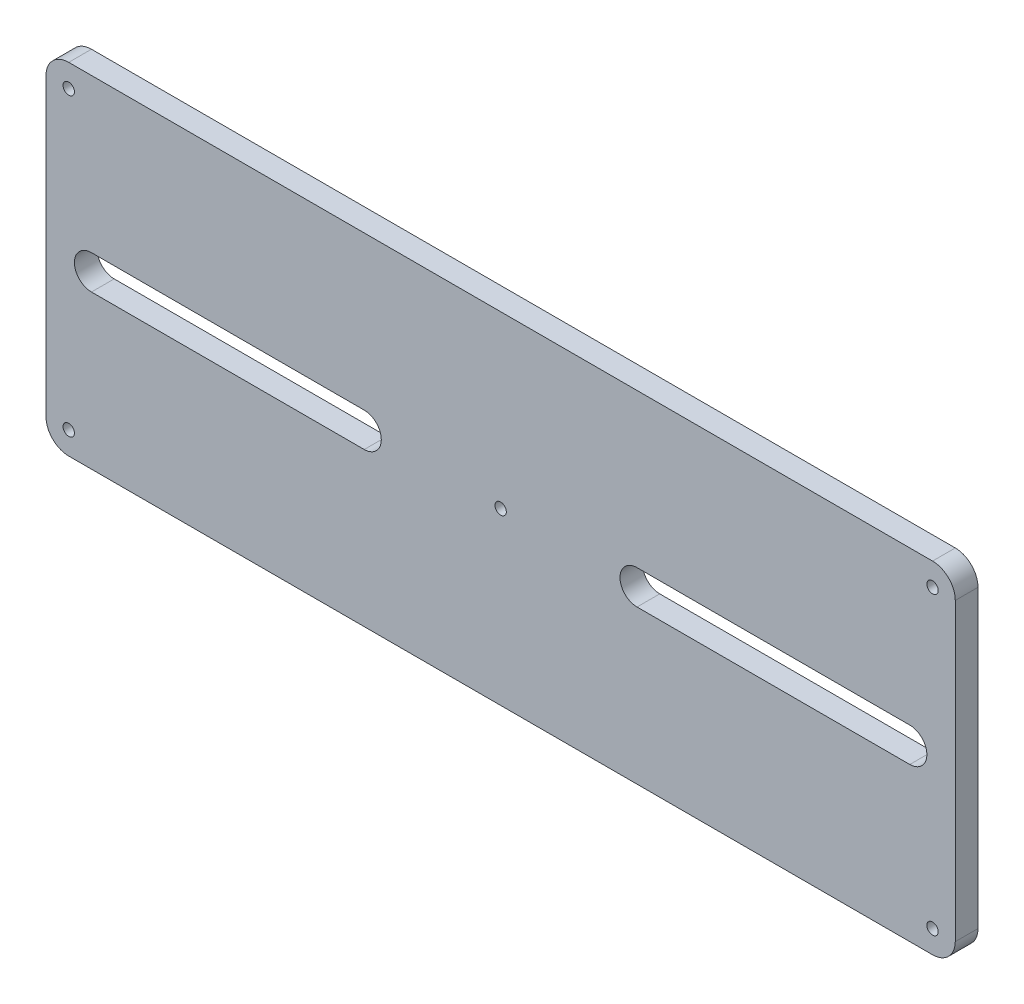
ISO-10303-21;
HEADER;
FILE_DESCRIPTION(('STEP AP214'),'2;1');
FILE_NAME('part.step','',(''),(''),'','','');
FILE_SCHEMA(('AUTOMOTIVE_DESIGN { 1 0 10303 214 1 1 1 1 }'));
ENDSEC;
DATA;
#1=APPLICATION_CONTEXT('core data for automotive mechanical design processes');
#2=APPLICATION_PROTOCOL_DEFINITION('international standard','automotive_design',2000,#1);
#3=PRODUCT_CONTEXT('',#1,'mechanical');
#4=PRODUCT('Part','Part','',(#3));
#5=PRODUCT_RELATED_PRODUCT_CATEGORY('part','',(#4));
#6=PRODUCT_DEFINITION_FORMATION('','',#4);
#7=PRODUCT_DEFINITION_CONTEXT('part definition',#1,'design');
#8=PRODUCT_DEFINITION('design','',#6,#7);
#9=PRODUCT_DEFINITION_SHAPE('','',#8);
#10=(LENGTH_UNIT() NAMED_UNIT(*) SI_UNIT(.MILLI.,.METRE.));
#11=(NAMED_UNIT(*) PLANE_ANGLE_UNIT() SI_UNIT($,.RADIAN.));
#12=(NAMED_UNIT(*) SI_UNIT($,.STERADIAN.) SOLID_ANGLE_UNIT());
#13=UNCERTAINTY_MEASURE_WITH_UNIT(LENGTH_MEASURE(1.E-05),#10,'distance_accuracy_value','');
#14=(GEOMETRIC_REPRESENTATION_CONTEXT(3) GLOBAL_UNCERTAINTY_ASSIGNED_CONTEXT((#13)) GLOBAL_UNIT_ASSIGNED_CONTEXT((#10,
#11,#12)) REPRESENTATION_CONTEXT('',''));
#15=CARTESIAN_POINT('',(0.,0.,0.));
#16=DIRECTION('',(0.,0.,1.));
#17=DIRECTION('',(1.,0.,0.));
#18=AXIS2_PLACEMENT_3D('',#15,#16,#17);
#19=CARTESIAN_POINT('',(-190.,-65.,10.));
#20=DIRECTION('',(0.,0.,-1.));
#21=DIRECTION('',(-1.,0.,0.));
#22=AXIS2_PLACEMENT_3D('',#19,#20,#21);
#23=PLANE('',#22);
#24=DIRECTION('',(-1.,0.,0.));
#25=VECTOR('',#24,1.);
#26=CARTESIAN_POINT('',(-60.,7.5,10.));
#27=LINE('',#26,#25);
#28=CARTESIAN_POINT('',(-60.,7.49999999999999,10.));
#29=VERTEX_POINT('',#28);
#30=CARTESIAN_POINT('',(-180.,7.5,10.));
#31=VERTEX_POINT('',#30);
#32=EDGE_CURVE('E178',#29,#31,#27,.T.);
#33=ORIENTED_EDGE('',*,*,#32,.F.);
#34=CARTESIAN_POINT('',(-60.,0.,10.));
#35=DIRECTION('',(0.,0.,1.));
#36=DIRECTION('',(1.,0.,0.));
#37=AXIS2_PLACEMENT_3D('',#34,#35,#36);
#38=CIRCLE('',#37,7.5);
#39=CARTESIAN_POINT('',(-60.,-7.5,10.));
#40=VERTEX_POINT('',#39);
#41=EDGE_CURVE('E50',#40,#29,#38,.T.);
#42=ORIENTED_EDGE('',*,*,#41,.F.);
#43=DIRECTION('',(1.,0.,0.));
#44=VECTOR('',#43,1.);
#45=CARTESIAN_POINT('',(-60.,-7.5,10.));
#46=LINE('',#45,#44);
#47=CARTESIAN_POINT('',(-180.,-7.5,10.));
#48=VERTEX_POINT('',#47);
#49=EDGE_CURVE('E169',#48,#40,#46,.T.);
#50=ORIENTED_EDGE('',*,*,#49,.F.);
#51=CARTESIAN_POINT('',(-180.,0.,10.));
#52=DIRECTION('',(0.,0.,1.));
#53=DIRECTION('',(1.,0.,0.));
#54=AXIS2_PLACEMENT_3D('',#51,#52,#53);
#55=CIRCLE('',#54,7.5);
#56=EDGE_CURVE('E172',#31,#48,#55,.T.);
#57=ORIENTED_EDGE('',*,*,#56,.F.);
#58=EDGE_LOOP('',(#33,#42,#50,#57));
#59=FACE_BOUND('',#58,.T.);
#60=DIRECTION('',(1.,0.,0.));
#61=VECTOR('',#60,1.);
#62=CARTESIAN_POINT('',(60.,-7.5,10.));
#63=LINE('',#62,#61);
#64=CARTESIAN_POINT('',(60.,-7.5,10.));
#65=VERTEX_POINT('',#64);
#66=CARTESIAN_POINT('',(180.,-7.5,10.));
#67=VERTEX_POINT('',#66);
#68=EDGE_CURVE('E204',#65,#67,#63,.T.);
#69=ORIENTED_EDGE('',*,*,#68,.F.);
#70=CARTESIAN_POINT('',(60.,0.,10.));
#71=DIRECTION('',(0.,0.,1.));
#72=DIRECTION('',(-1.,0.,0.));
#73=AXIS2_PLACEMENT_3D('',#70,#71,#72);
#74=CIRCLE('',#73,7.5);
#75=CARTESIAN_POINT('',(60.,7.5,10.));
#76=VERTEX_POINT('',#75);
#77=EDGE_CURVE('E58',#76,#65,#74,.T.);
#78=ORIENTED_EDGE('',*,*,#77,.F.);
#79=DIRECTION('',(-1.,0.,0.));
#80=VECTOR('',#79,1.);
#81=CARTESIAN_POINT('',(60.,7.5,10.));
#82=LINE('',#81,#80);
#83=CARTESIAN_POINT('',(180.,7.5,10.));
#84=VERTEX_POINT('',#83);
#85=EDGE_CURVE('E193',#84,#76,#82,.T.);
#86=ORIENTED_EDGE('',*,*,#85,.F.);
#87=CARTESIAN_POINT('',(180.,0.,10.));
#88=DIRECTION('',(0.,0.,1.));
#89=DIRECTION('',(-1.,0.,0.));
#90=AXIS2_PLACEMENT_3D('',#87,#88,#89);
#91=CIRCLE('',#90,7.5);
#92=EDGE_CURVE('E208',#67,#84,#91,.T.);
#93=ORIENTED_EDGE('',*,*,#92,.F.);
#94=EDGE_LOOP('',(#69,#78,#86,#93));
#95=FACE_BOUND('',#94,.T.);
#96=CARTESIAN_POINT('',(0.,0.,10.));
#97=DIRECTION('',(0.,0.,1.));
#98=DIRECTION('',(1.,0.,0.));
#99=AXIS2_PLACEMENT_3D('',#96,#97,#98);
#100=CIRCLE('',#99,2.5);
#101=CARTESIAN_POINT('',(2.5,0.,10.));
#102=VERTEX_POINT('',#101);
#103=EDGE_CURVE('E221',#102,#102,#100,.T.);
#104=ORIENTED_EDGE('',*,*,#103,.F.);
#105=EDGE_LOOP('',(#104));
#106=FACE_BOUND('',#105,.T.);
#107=CARTESIAN_POINT('',(-190.,-65.,10.));
#108=DIRECTION('',(0.,0.,1.));
#109=DIRECTION('',(-1.,0.,0.));
#110=AXIS2_PLACEMENT_3D('',#107,#108,#109);
#111=CIRCLE('',#110,10.);
#112=CARTESIAN_POINT('',(-200.,-65.,10.));
#113=VERTEX_POINT('',#112);
#114=CARTESIAN_POINT('',(-190.,-75.,10.));
#115=VERTEX_POINT('',#114);
#116=EDGE_CURVE('E248',#113,#115,#111,.T.);
#117=ORIENTED_EDGE('',*,*,#116,.T.);
#118=DIRECTION('',(1.,0.,0.));
#119=VECTOR('',#118,1.);
#120=CARTESIAN_POINT('',(-190.,-75.,10.));
#121=LINE('',#120,#119);
#122=CARTESIAN_POINT('',(190.,-75.,10.));
#123=VERTEX_POINT('',#122);
#124=EDGE_CURVE('E251',#115,#123,#121,.T.);
#125=ORIENTED_EDGE('',*,*,#124,.T.);
#126=CARTESIAN_POINT('',(190.,-64.9999999999999,10.));
#127=DIRECTION('',(0.,0.,1.));
#128=DIRECTION('',(1.,0.,0.));
#129=AXIS2_PLACEMENT_3D('',#126,#127,#128);
#130=CIRCLE('',#129,10.);
#131=CARTESIAN_POINT('',(200.,-64.9999999999999,10.));
#132=VERTEX_POINT('',#131);
#133=EDGE_CURVE('E254',#123,#132,#130,.T.);
#134=ORIENTED_EDGE('',*,*,#133,.T.);
#135=DIRECTION('',(0.,1.,0.));
#136=VECTOR('',#135,1.);
#137=CARTESIAN_POINT('',(200.,-65.,10.));
#138=LINE('',#137,#136);
#139=CARTESIAN_POINT('',(200.,65.,10.));
#140=VERTEX_POINT('',#139);
#141=EDGE_CURVE('E256',#132,#140,#138,.T.);
#142=ORIENTED_EDGE('',*,*,#141,.T.);
#143=CARTESIAN_POINT('',(190.,64.9999999999999,10.));
#144=DIRECTION('',(0.,0.,1.));
#145=DIRECTION('',(-1.,0.,0.));
#146=AXIS2_PLACEMENT_3D('',#143,#144,#145);
#147=CIRCLE('',#146,10.);
#148=CARTESIAN_POINT('',(190.,75.,10.));
#149=VERTEX_POINT('',#148);
#150=EDGE_CURVE('E258',#140,#149,#147,.T.);
#151=ORIENTED_EDGE('',*,*,#150,.T.);
#152=DIRECTION('',(-1.,0.,0.));
#153=VECTOR('',#152,1.);
#154=CARTESIAN_POINT('',(-190.,75.,10.));
#155=LINE('',#154,#153);
#156=CARTESIAN_POINT('',(-190.,75.,10.));
#157=VERTEX_POINT('',#156);
#158=EDGE_CURVE('E260',#149,#157,#155,.T.);
#159=ORIENTED_EDGE('',*,*,#158,.T.);
#160=CARTESIAN_POINT('',(-190.,64.9999999999999,10.));
#161=DIRECTION('',(0.,0.,1.));
#162=DIRECTION('',(-1.,0.,0.));
#163=AXIS2_PLACEMENT_3D('',#160,#161,#162);
#164=CIRCLE('',#163,10.);
#165=CARTESIAN_POINT('',(-200.,65.,10.));
#166=VERTEX_POINT('',#165);
#167=EDGE_CURVE('E262',#157,#166,#164,.T.);
#168=ORIENTED_EDGE('',*,*,#167,.T.);
#169=DIRECTION('',(0.,-1.,0.));
#170=VECTOR('',#169,1.);
#171=CARTESIAN_POINT('',(-200.,-65.,10.));
#172=LINE('',#171,#170);
#173=EDGE_CURVE('E264',#166,#113,#172,.T.);
#174=ORIENTED_EDGE('',*,*,#173,.T.);
#175=EDGE_LOOP('',(#117,#125,#134,#142,#151,#159,#168,#174));
#176=FACE_BOUND('',#175,.T.);
#177=CARTESIAN_POINT('',(-190.,64.9999999999999,10.));
#178=DIRECTION('',(0.,0.,1.));
#179=DIRECTION('',(1.,0.,0.));
#180=AXIS2_PLACEMENT_3D('',#177,#178,#179);
#181=CIRCLE('',#180,2.5);
#182=CARTESIAN_POINT('',(-187.5,64.9999999999999,10.));
#183=VERTEX_POINT('',#182);
#184=EDGE_CURVE('E242',#183,#183,#181,.T.);
#185=ORIENTED_EDGE('',*,*,#184,.F.);
#186=EDGE_LOOP('',(#185));
#187=FACE_BOUND('',#186,.T.);
#188=CARTESIAN_POINT('',(-190.,-65.,10.));
#189=DIRECTION('',(0.,0.,1.));
#190=DIRECTION('',(-1.,0.,0.));
#191=AXIS2_PLACEMENT_3D('',#188,#189,#190);
#192=CIRCLE('',#191,2.5);
#193=CARTESIAN_POINT('',(-192.5,-65.,10.));
#194=VERTEX_POINT('',#193);
#195=EDGE_CURVE('E236',#194,#194,#192,.T.);
#196=ORIENTED_EDGE('',*,*,#195,.F.);
#197=EDGE_LOOP('',(#196));
#198=FACE_BOUND('',#197,.T.);
#199=CARTESIAN_POINT('',(190.,-64.9999999999999,10.));
#200=DIRECTION('',(0.,0.,1.));
#201=DIRECTION('',(1.,0.,0.));
#202=AXIS2_PLACEMENT_3D('',#199,#200,#201);
#203=CIRCLE('',#202,2.50000000000005);
#204=CARTESIAN_POINT('',(192.5,-64.9999999999999,10.));
#205=VERTEX_POINT('',#204);
#206=EDGE_CURVE('E230',#205,#205,#203,.T.);
#207=ORIENTED_EDGE('',*,*,#206,.F.);
#208=EDGE_LOOP('',(#207));
#209=FACE_BOUND('',#208,.T.);
#210=CARTESIAN_POINT('',(190.,64.9999999999999,10.));
#211=DIRECTION('',(0.,0.,1.));
#212=DIRECTION('',(-1.,0.,0.));
#213=AXIS2_PLACEMENT_3D('',#210,#211,#212);
#214=CIRCLE('',#213,2.50000000000005);
#215=CARTESIAN_POINT('',(187.5,64.9999999999999,10.));
#216=VERTEX_POINT('',#215);
#217=EDGE_CURVE('E224',#216,#216,#214,.T.);
#218=ORIENTED_EDGE('',*,*,#217,.F.);
#219=EDGE_LOOP('',(#218));
#220=FACE_BOUND('',#219,.T.);
#221=ADVANCED_FACE('F35',(#59,#95,#106,#176,#187,#198,#209,#220),#23,.F.);
#222=CARTESIAN_POINT('',(-190.,-65.,0.));
#223=DIRECTION('',(0.,0.,-1.));
#224=DIRECTION('',(-1.,0.,0.));
#225=AXIS2_PLACEMENT_3D('',#222,#223,#224);
#226=PLANE('',#225);
#227=CARTESIAN_POINT('',(-60.,0.,0.));
#228=DIRECTION('',(0.,0.,1.));
#229=DIRECTION('',(1.,0.,0.));
#230=AXIS2_PLACEMENT_3D('',#227,#228,#229);
#231=CIRCLE('',#230,7.5);
#232=CARTESIAN_POINT('',(-60.,-7.5,0.));
#233=VERTEX_POINT('',#232);
#234=CARTESIAN_POINT('',(-60.,7.5,0.));
#235=VERTEX_POINT('',#234);
#236=EDGE_CURVE('E150',#233,#235,#231,.T.);
#237=ORIENTED_EDGE('',*,*,#236,.T.);
#238=DIRECTION('',(-1.,0.,0.));
#239=VECTOR('',#238,1.);
#240=CARTESIAN_POINT('',(-60.,7.5,0.));
#241=LINE('',#240,#239);
#242=CARTESIAN_POINT('',(-180.,7.49999999999999,0.));
#243=VERTEX_POINT('',#242);
#244=EDGE_CURVE('E160',#235,#243,#241,.T.);
#245=ORIENTED_EDGE('',*,*,#244,.T.);
#246=CARTESIAN_POINT('',(-180.,0.,0.));
#247=DIRECTION('',(0.,0.,1.));
#248=DIRECTION('',(1.,0.,0.));
#249=AXIS2_PLACEMENT_3D('',#246,#247,#248);
#250=CIRCLE('',#249,7.5);
#251=CARTESIAN_POINT('',(-180.,-7.5,0.));
#252=VERTEX_POINT('',#251);
#253=EDGE_CURVE('E164',#243,#252,#250,.T.);
#254=ORIENTED_EDGE('',*,*,#253,.T.);
#255=DIRECTION('',(1.,0.,0.));
#256=VECTOR('',#255,1.);
#257=CARTESIAN_POINT('',(-60.,-7.5,0.));
#258=LINE('',#257,#256);
#259=EDGE_CURVE('E156',#252,#233,#258,.T.);
#260=ORIENTED_EDGE('',*,*,#259,.T.);
#261=EDGE_LOOP('',(#237,#245,#254,#260));
#262=FACE_BOUND('',#261,.T.);
#263=CARTESIAN_POINT('',(60.,0.,0.));
#264=DIRECTION('',(0.,0.,1.));
#265=DIRECTION('',(-1.,0.,0.));
#266=AXIS2_PLACEMENT_3D('',#263,#264,#265);
#267=CIRCLE('',#266,7.5);
#268=CARTESIAN_POINT('',(60.,7.5,0.));
#269=VERTEX_POINT('',#268);
#270=CARTESIAN_POINT('',(60.,-7.5,0.));
#271=VERTEX_POINT('',#270);
#272=EDGE_CURVE('E189',#269,#271,#267,.T.);
#273=ORIENTED_EDGE('',*,*,#272,.T.);
#274=DIRECTION('',(1.,0.,0.));
#275=VECTOR('',#274,1.);
#276=CARTESIAN_POINT('',(60.,-7.5,0.));
#277=LINE('',#276,#275);
#278=CARTESIAN_POINT('',(180.,-7.5,0.));
#279=VERTEX_POINT('',#278);
#280=EDGE_CURVE('E192',#271,#279,#277,.T.);
#281=ORIENTED_EDGE('',*,*,#280,.T.);
#282=CARTESIAN_POINT('',(180.,0.,0.));
#283=DIRECTION('',(0.,0.,1.));
#284=DIRECTION('',(-1.,0.,0.));
#285=AXIS2_PLACEMENT_3D('',#282,#283,#284);
#286=CIRCLE('',#285,7.5);
#287=CARTESIAN_POINT('',(180.,7.5,0.));
#288=VERTEX_POINT('',#287);
#289=EDGE_CURVE('E196',#279,#288,#286,.T.);
#290=ORIENTED_EDGE('',*,*,#289,.T.);
#291=DIRECTION('',(-1.,0.,0.));
#292=VECTOR('',#291,1.);
#293=CARTESIAN_POINT('',(60.,7.5,0.));
#294=LINE('',#293,#292);
#295=EDGE_CURVE('E199',#288,#269,#294,.T.);
#296=ORIENTED_EDGE('',*,*,#295,.T.);
#297=EDGE_LOOP('',(#273,#281,#290,#296));
#298=FACE_BOUND('',#297,.T.);
#299=CARTESIAN_POINT('',(0.,0.,0.));
#300=DIRECTION('',(0.,0.,1.));
#301=DIRECTION('',(1.,0.,0.));
#302=AXIS2_PLACEMENT_3D('',#299,#300,#301);
#303=CIRCLE('',#302,2.5);
#304=CARTESIAN_POINT('',(2.5,0.,0.));
#305=VERTEX_POINT('',#304);
#306=EDGE_CURVE('E205',#305,#305,#303,.T.);
#307=ORIENTED_EDGE('',*,*,#306,.T.);
#308=EDGE_LOOP('',(#307));
#309=FACE_BOUND('',#308,.T.);
#310=CARTESIAN_POINT('',(190.,-64.9999999999999,0.));
#311=DIRECTION('',(0.,0.,1.));
#312=DIRECTION('',(1.,0.,0.));
#313=AXIS2_PLACEMENT_3D('',#310,#311,#312);
#314=CIRCLE('',#313,2.50000000000005);
#315=CARTESIAN_POINT('',(192.5,-64.9999999999999,0.));
#316=VERTEX_POINT('',#315);
#317=EDGE_CURVE('E227',#316,#316,#314,.T.);
#318=ORIENTED_EDGE('',*,*,#317,.T.);
#319=EDGE_LOOP('',(#318));
#320=FACE_BOUND('',#319,.T.);
#321=CARTESIAN_POINT('',(-190.,64.9999999999999,0.));
#322=DIRECTION('',(0.,0.,1.));
#323=DIRECTION('',(1.,0.,0.));
#324=AXIS2_PLACEMENT_3D('',#321,#322,#323);
#325=CIRCLE('',#324,2.5);
#326=CARTESIAN_POINT('',(-187.5,64.9999999999999,0.));
#327=VERTEX_POINT('',#326);
#328=EDGE_CURVE('E239',#327,#327,#325,.T.);
#329=ORIENTED_EDGE('',*,*,#328,.T.);
#330=EDGE_LOOP('',(#329));
#331=FACE_BOUND('',#330,.T.);
#332=CARTESIAN_POINT('',(-190.,-65.,0.));
#333=DIRECTION('',(0.,0.,1.));
#334=DIRECTION('',(-1.,0.,0.));
#335=AXIS2_PLACEMENT_3D('',#332,#333,#334);
#336=CIRCLE('',#335,10.);
#337=CARTESIAN_POINT('',(-200.,-65.,0.));
#338=VERTEX_POINT('',#337);
#339=CARTESIAN_POINT('',(-190.,-75.,0.));
#340=VERTEX_POINT('',#339);
#341=EDGE_CURVE('E245',#338,#340,#336,.T.);
#342=ORIENTED_EDGE('',*,*,#341,.F.);
#343=DIRECTION('',(0.,-1.,0.));
#344=VECTOR('',#343,1.);
#345=CARTESIAN_POINT('',(-200.,-65.,0.));
#346=LINE('',#345,#344);
#347=CARTESIAN_POINT('',(-200.,65.,0.));
#348=VERTEX_POINT('',#347);
#349=EDGE_CURVE('E252',#348,#338,#346,.T.);
#350=ORIENTED_EDGE('',*,*,#349,.F.);
#351=CARTESIAN_POINT('',(-190.,64.9999999999999,0.));
#352=DIRECTION('',(0.,0.,1.));
#353=DIRECTION('',(-1.,0.,0.));
#354=AXIS2_PLACEMENT_3D('',#351,#352,#353);
#355=CIRCLE('',#354,10.);
#356=CARTESIAN_POINT('',(-190.,75.,0.));
#357=VERTEX_POINT('',#356);
#358=EDGE_CURVE('E279',#357,#348,#355,.T.);
#359=ORIENTED_EDGE('',*,*,#358,.F.);
#360=DIRECTION('',(-1.,0.,0.));
#361=VECTOR('',#360,1.);
#362=CARTESIAN_POINT('',(-190.,75.,0.));
#363=LINE('',#362,#361);
#364=CARTESIAN_POINT('',(190.,75.,0.));
#365=VERTEX_POINT('',#364);
#366=EDGE_CURVE('E277',#365,#357,#363,.T.);
#367=ORIENTED_EDGE('',*,*,#366,.F.);
#368=CARTESIAN_POINT('',(190.,64.9999999999999,0.));
#369=DIRECTION('',(0.,0.,1.));
#370=DIRECTION('',(-1.,0.,0.));
#371=AXIS2_PLACEMENT_3D('',#368,#369,#370);
#372=CIRCLE('',#371,10.);
#373=CARTESIAN_POINT('',(200.,65.,0.));
#374=VERTEX_POINT('',#373);
#375=EDGE_CURVE('E275',#374,#365,#372,.T.);
#376=ORIENTED_EDGE('',*,*,#375,.F.);
#377=DIRECTION('',(0.,1.,0.));
#378=VECTOR('',#377,1.);
#379=CARTESIAN_POINT('',(200.,-65.,0.));
#380=LINE('',#379,#378);
#381=CARTESIAN_POINT('',(200.,-64.9999999999999,0.));
#382=VERTEX_POINT('',#381);
#383=EDGE_CURVE('E273',#382,#374,#380,.T.);
#384=ORIENTED_EDGE('',*,*,#383,.F.);
#385=CARTESIAN_POINT('',(190.,-64.9999999999999,0.));
#386=DIRECTION('',(0.,0.,1.));
#387=DIRECTION('',(1.,0.,0.));
#388=AXIS2_PLACEMENT_3D('',#385,#386,#387);
#389=CIRCLE('',#388,10.);
#390=CARTESIAN_POINT('',(190.,-75.,0.));
#391=VERTEX_POINT('',#390);
#392=EDGE_CURVE('E271',#391,#382,#389,.T.);
#393=ORIENTED_EDGE('',*,*,#392,.F.);
#394=DIRECTION('',(1.,0.,0.));
#395=VECTOR('',#394,1.);
#396=CARTESIAN_POINT('',(-190.,-75.,0.));
#397=LINE('',#396,#395);
#398=EDGE_CURVE('E269',#340,#391,#397,.T.);
#399=ORIENTED_EDGE('',*,*,#398,.F.);
#400=EDGE_LOOP('',(#342,#350,#359,#367,#376,#384,#393,#399));
#401=FACE_BOUND('',#400,.T.);
#402=CARTESIAN_POINT('',(-190.,-65.,0.));
#403=DIRECTION('',(0.,0.,1.));
#404=DIRECTION('',(-1.,0.,0.));
#405=AXIS2_PLACEMENT_3D('',#402,#403,#404);
#406=CIRCLE('',#405,2.5);
#407=CARTESIAN_POINT('',(-192.5,-65.,0.));
#408=VERTEX_POINT('',#407);
#409=EDGE_CURVE('E233',#408,#408,#406,.T.);
#410=ORIENTED_EDGE('',*,*,#409,.T.);
#411=EDGE_LOOP('',(#410));
#412=FACE_BOUND('',#411,.T.);
#413=CARTESIAN_POINT('',(190.,64.9999999999999,0.));
#414=DIRECTION('',(0.,0.,1.));
#415=DIRECTION('',(-1.,0.,0.));
#416=AXIS2_PLACEMENT_3D('',#413,#414,#415);
#417=CIRCLE('',#416,2.50000000000005);
#418=CARTESIAN_POINT('',(187.5,64.9999999999999,0.));
#419=VERTEX_POINT('',#418);
#420=EDGE_CURVE('E185',#419,#419,#417,.T.);
#421=ORIENTED_EDGE('',*,*,#420,.T.);
#422=EDGE_LOOP('',(#421));
#423=FACE_BOUND('',#422,.T.);
#424=ADVANCED_FACE('F166',(#262,#298,#309,#320,#331,#401,#412,#423),#226,.T.);
#425=CARTESIAN_POINT('',(-190.,-65.,10.));
#426=DIRECTION('',(0.,0.,-1.));
#427=DIRECTION('',(-1.,0.,0.));
#428=AXIS2_PLACEMENT_3D('',#425,#426,#427);
#429=CYLINDRICAL_SURFACE('',#428,10.);
#430=ORIENTED_EDGE('',*,*,#341,.T.);
#431=DIRECTION('',(0.,0.,-1.));
#432=VECTOR('',#431,1.);
#433=CARTESIAN_POINT('',(-190.,-75.,10.));
#434=LINE('',#433,#432);
#435=EDGE_CURVE('E11',#115,#340,#434,.T.);
#436=ORIENTED_EDGE('',*,*,#435,.F.);
#437=ORIENTED_EDGE('',*,*,#116,.F.);
#438=DIRECTION('',(0.,0.,-1.));
#439=VECTOR('',#438,1.);
#440=CARTESIAN_POINT('',(-200.,-65.,10.));
#441=LINE('',#440,#439);
#442=EDGE_CURVE('E266',#113,#338,#441,.T.);
#443=ORIENTED_EDGE('',*,*,#442,.T.);
#444=EDGE_LOOP('',(#430,#436,#437,#443));
#445=FACE_BOUND('',#444,.T.);
#446=ADVANCED_FACE('F37',(#445),#429,.T.);
#447=CARTESIAN_POINT('',(-190.,-75.,10.));
#448=DIRECTION('',(0.,1.,0.));
#449=DIRECTION('',(0.,0.,1.));
#450=AXIS2_PLACEMENT_3D('',#447,#448,#449);
#451=PLANE('',#450);
#452=ORIENTED_EDGE('',*,*,#398,.T.);
#453=DIRECTION('',(0.,0.,-1.));
#454=VECTOR('',#453,1.);
#455=CARTESIAN_POINT('',(190.,-75.,10.));
#456=LINE('',#455,#454);
#457=EDGE_CURVE('E43',#123,#391,#456,.T.);
#458=ORIENTED_EDGE('',*,*,#457,.F.);
#459=ORIENTED_EDGE('',*,*,#124,.F.);
#460=ORIENTED_EDGE('',*,*,#435,.T.);
#461=EDGE_LOOP('',(#452,#458,#459,#460));
#462=FACE_BOUND('',#461,.T.);
#463=ADVANCED_FACE('F326',(#462),#451,.F.);
#464=CARTESIAN_POINT('',(190.,-64.9999999999999,10.));
#465=DIRECTION('',(0.,0.,-1.));
#466=DIRECTION('',(-1.,0.,0.));
#467=AXIS2_PLACEMENT_3D('',#464,#465,#466);
#468=CYLINDRICAL_SURFACE('',#467,10.);
#469=ORIENTED_EDGE('',*,*,#392,.T.);
#470=DIRECTION('',(0.,0.,-1.));
#471=VECTOR('',#470,1.);
#472=CARTESIAN_POINT('',(200.,-64.9999999999999,10.));
#473=LINE('',#472,#471);
#474=EDGE_CURVE('E296',#132,#382,#473,.T.);
#475=ORIENTED_EDGE('',*,*,#474,.F.);
#476=ORIENTED_EDGE('',*,*,#133,.F.);
#477=ORIENTED_EDGE('',*,*,#457,.T.);
#478=EDGE_LOOP('',(#469,#475,#476,#477));
#479=FACE_BOUND('',#478,.T.);
#480=ADVANCED_FACE('F303',(#479),#468,.T.);
#481=CARTESIAN_POINT('',(200.,-65.,10.));
#482=DIRECTION('',(-1.,0.,0.));
#483=DIRECTION('',(0.,-1.,0.));
#484=AXIS2_PLACEMENT_3D('',#481,#482,#483);
#485=PLANE('',#484);
#486=ORIENTED_EDGE('',*,*,#383,.T.);
#487=DIRECTION('',(0.,0.,-1.));
#488=VECTOR('',#487,1.);
#489=CARTESIAN_POINT('',(200.,65.,10.));
#490=LINE('',#489,#488);
#491=EDGE_CURVE('E293',#140,#374,#490,.T.);
#492=ORIENTED_EDGE('',*,*,#491,.F.);
#493=ORIENTED_EDGE('',*,*,#141,.F.);
#494=ORIENTED_EDGE('',*,*,#474,.T.);
#495=EDGE_LOOP('',(#486,#492,#493,#494));
#496=FACE_BOUND('',#495,.T.);
#497=ADVANCED_FACE('F314',(#496),#485,.F.);
#498=CARTESIAN_POINT('',(190.,64.9999999999999,10.));
#499=DIRECTION('',(0.,0.,-1.));
#500=DIRECTION('',(-1.,0.,0.));
#501=AXIS2_PLACEMENT_3D('',#498,#499,#500);
#502=CYLINDRICAL_SURFACE('',#501,10.);
#503=ORIENTED_EDGE('',*,*,#375,.T.);
#504=DIRECTION('',(0.,0.,-1.));
#505=VECTOR('',#504,1.);
#506=CARTESIAN_POINT('',(190.,75.,10.));
#507=LINE('',#506,#505);
#508=EDGE_CURVE('E290',#149,#365,#507,.T.);
#509=ORIENTED_EDGE('',*,*,#508,.F.);
#510=ORIENTED_EDGE('',*,*,#150,.F.);
#511=ORIENTED_EDGE('',*,*,#491,.T.);
#512=EDGE_LOOP('',(#503,#509,#510,#511));
#513=FACE_BOUND('',#512,.T.);
#514=ADVANCED_FACE('F318',(#513),#502,.T.);
#515=CARTESIAN_POINT('',(-190.,75.,10.));
#516=DIRECTION('',(0.,-1.,0.));
#517=DIRECTION('',(0.,0.,-1.));
#518=AXIS2_PLACEMENT_3D('',#515,#516,#517);
#519=PLANE('',#518);
#520=ORIENTED_EDGE('',*,*,#366,.T.);
#521=DIRECTION('',(0.,0.,-1.));
#522=VECTOR('',#521,1.);
#523=CARTESIAN_POINT('',(-190.,75.,10.));
#524=LINE('',#523,#522);
#525=EDGE_CURVE('E287',#157,#357,#524,.T.);
#526=ORIENTED_EDGE('',*,*,#525,.F.);
#527=ORIENTED_EDGE('',*,*,#158,.F.);
#528=ORIENTED_EDGE('',*,*,#508,.T.);
#529=EDGE_LOOP('',(#520,#526,#527,#528));
#530=FACE_BOUND('',#529,.T.);
#531=ADVANCED_FACE('F339',(#530),#519,.F.);
#532=CARTESIAN_POINT('',(-190.,64.9999999999999,10.));
#533=DIRECTION('',(0.,0.,-1.));
#534=DIRECTION('',(-1.,0.,0.));
#535=AXIS2_PLACEMENT_3D('',#532,#533,#534);
#536=CYLINDRICAL_SURFACE('',#535,10.);
#537=ORIENTED_EDGE('',*,*,#358,.T.);
#538=DIRECTION('',(0.,0.,-1.));
#539=VECTOR('',#538,1.);
#540=CARTESIAN_POINT('',(-200.,65.,10.));
#541=LINE('',#540,#539);
#542=EDGE_CURVE('E284',#166,#348,#541,.T.);
#543=ORIENTED_EDGE('',*,*,#542,.F.);
#544=ORIENTED_EDGE('',*,*,#167,.F.);
#545=ORIENTED_EDGE('',*,*,#525,.T.);
#546=EDGE_LOOP('',(#537,#543,#544,#545));
#547=FACE_BOUND('',#546,.T.);
#548=ADVANCED_FACE('F337',(#547),#536,.T.);
#549=CARTESIAN_POINT('',(-200.,-65.,10.));
#550=DIRECTION('',(1.,0.,0.));
#551=DIRECTION('',(0.,1.,0.));
#552=AXIS2_PLACEMENT_3D('',#549,#550,#551);
#553=PLANE('',#552);
#554=ORIENTED_EDGE('',*,*,#349,.T.);
#555=ORIENTED_EDGE('',*,*,#442,.F.);
#556=ORIENTED_EDGE('',*,*,#173,.F.);
#557=ORIENTED_EDGE('',*,*,#542,.T.);
#558=EDGE_LOOP('',(#554,#555,#556,#557));
#559=FACE_BOUND('',#558,.T.);
#560=ADVANCED_FACE('F332',(#559),#553,.F.);
#561=CARTESIAN_POINT('',(-190.,64.9999999999999,10.));
#562=DIRECTION('',(0.,0.,-1.));
#563=DIRECTION('',(-1.,0.,0.));
#564=AXIS2_PLACEMENT_3D('',#561,#562,#563);
#565=CYLINDRICAL_SURFACE('',#564,2.5);
#566=ORIENTED_EDGE('',*,*,#184,.T.);
#567=EDGE_LOOP('',(#566));
#568=FACE_BOUND('',#567,.T.);
#569=ORIENTED_EDGE('',*,*,#328,.F.);
#570=EDGE_LOOP('',(#569));
#571=FACE_BOUND('',#570,.T.);
#572=ADVANCED_FACE('F357',(#568,#571),#565,.F.);
#573=CARTESIAN_POINT('',(-190.,-65.,10.));
#574=DIRECTION('',(0.,0.,-1.));
#575=DIRECTION('',(-1.,0.,0.));
#576=AXIS2_PLACEMENT_3D('',#573,#574,#575);
#577=CYLINDRICAL_SURFACE('',#576,2.5);
#578=ORIENTED_EDGE('',*,*,#195,.T.);
#579=EDGE_LOOP('',(#578));
#580=FACE_BOUND('',#579,.T.);
#581=ORIENTED_EDGE('',*,*,#409,.F.);
#582=EDGE_LOOP('',(#581));
#583=FACE_BOUND('',#582,.T.);
#584=ADVANCED_FACE('F364',(#580,#583),#577,.F.);
#585=CARTESIAN_POINT('',(190.,-64.9999999999999,10.));
#586=DIRECTION('',(0.,0.,-1.));
#587=DIRECTION('',(-1.,0.,0.));
#588=AXIS2_PLACEMENT_3D('',#585,#586,#587);
#589=CYLINDRICAL_SURFACE('',#588,2.50000000000005);
#590=ORIENTED_EDGE('',*,*,#206,.T.);
#591=EDGE_LOOP('',(#590));
#592=FACE_BOUND('',#591,.T.);
#593=ORIENTED_EDGE('',*,*,#317,.F.);
#594=EDGE_LOOP('',(#593));
#595=FACE_BOUND('',#594,.T.);
#596=ADVANCED_FACE('F369',(#592,#595),#589,.F.);
#597=CARTESIAN_POINT('',(190.,64.9999999999999,10.));
#598=DIRECTION('',(0.,0.,-1.));
#599=DIRECTION('',(-1.,0.,0.));
#600=AXIS2_PLACEMENT_3D('',#597,#598,#599);
#601=CYLINDRICAL_SURFACE('',#600,2.50000000000005);
#602=ORIENTED_EDGE('',*,*,#217,.T.);
#603=EDGE_LOOP('',(#602));
#604=FACE_BOUND('',#603,.T.);
#605=ORIENTED_EDGE('',*,*,#420,.F.);
#606=EDGE_LOOP('',(#605));
#607=FACE_BOUND('',#606,.T.);
#608=ADVANCED_FACE('F382',(#604,#607),#601,.F.);
#609=CARTESIAN_POINT('',(0.,0.,0.));
#610=DIRECTION('',(0.,0.,1.));
#611=DIRECTION('',(1.,0.,0.));
#612=AXIS2_PLACEMENT_3D('',#609,#610,#611);
#613=CYLINDRICAL_SURFACE('',#612,2.5);
#614=ORIENTED_EDGE('',*,*,#306,.F.);
#615=EDGE_LOOP('',(#614));
#616=FACE_BOUND('',#615,.T.);
#617=ORIENTED_EDGE('',*,*,#103,.T.);
#618=EDGE_LOOP('',(#617));
#619=FACE_BOUND('',#618,.T.);
#620=ADVANCED_FACE('F385',(#616,#619),#613,.F.);
#621=CARTESIAN_POINT('',(60.,0.,0.));
#622=DIRECTION('',(0.,0.,1.));
#623=DIRECTION('',(1.,0.,0.));
#624=AXIS2_PLACEMENT_3D('',#621,#622,#623);
#625=CYLINDRICAL_SURFACE('',#624,7.5);
#626=ORIENTED_EDGE('',*,*,#77,.T.);
#627=DIRECTION('',(0.,0.,1.));
#628=VECTOR('',#627,1.);
#629=CARTESIAN_POINT('',(60.,-7.5,0.));
#630=LINE('',#629,#628);
#631=EDGE_CURVE('E202',#271,#65,#630,.T.);
#632=ORIENTED_EDGE('',*,*,#631,.F.);
#633=ORIENTED_EDGE('',*,*,#272,.F.);
#634=DIRECTION('',(0.,0.,1.));
#635=VECTOR('',#634,1.);
#636=CARTESIAN_POINT('',(60.,7.5,0.));
#637=LINE('',#636,#635);
#638=EDGE_CURVE('E179',#269,#76,#637,.T.);
#639=ORIENTED_EDGE('',*,*,#638,.T.);
#640=EDGE_LOOP('',(#626,#632,#633,#639));
#641=FACE_BOUND('',#640,.T.);
#642=ADVANCED_FACE('F393',(#641),#625,.F.);
#643=CARTESIAN_POINT('',(60.,7.5,0.));
#644=DIRECTION('',(0.,1.,0.));
#645=DIRECTION('',(0.,0.,1.));
#646=AXIS2_PLACEMENT_3D('',#643,#644,#645);
#647=PLANE('',#646);
#648=ORIENTED_EDGE('',*,*,#85,.T.);
#649=ORIENTED_EDGE('',*,*,#638,.F.);
#650=ORIENTED_EDGE('',*,*,#295,.F.);
#651=DIRECTION('',(0.,0.,1.));
#652=VECTOR('',#651,1.);
#653=CARTESIAN_POINT('',(180.,7.5,0.));
#654=LINE('',#653,#652);
#655=EDGE_CURVE('E214',#288,#84,#654,.T.);
#656=ORIENTED_EDGE('',*,*,#655,.T.);
#657=EDGE_LOOP('',(#648,#649,#650,#656));
#658=FACE_BOUND('',#657,.T.);
#659=ADVANCED_FACE('F401',(#658),#647,.F.);
#660=CARTESIAN_POINT('',(180.,0.,0.));
#661=DIRECTION('',(0.,0.,1.));
#662=DIRECTION('',(1.,0.,0.));
#663=AXIS2_PLACEMENT_3D('',#660,#661,#662);
#664=CYLINDRICAL_SURFACE('',#663,7.5);
#665=ORIENTED_EDGE('',*,*,#92,.T.);
#666=ORIENTED_EDGE('',*,*,#655,.F.);
#667=ORIENTED_EDGE('',*,*,#289,.F.);
#668=DIRECTION('',(0.,0.,1.));
#669=VECTOR('',#668,1.);
#670=CARTESIAN_POINT('',(180.,-7.5,0.));
#671=LINE('',#670,#669);
#672=EDGE_CURVE('E216',#279,#67,#671,.T.);
#673=ORIENTED_EDGE('',*,*,#672,.T.);
#674=EDGE_LOOP('',(#665,#666,#667,#673));
#675=FACE_BOUND('',#674,.T.);
#676=ADVANCED_FACE('F405',(#675),#664,.F.);
#677=CARTESIAN_POINT('',(60.,-7.5,0.));
#678=DIRECTION('',(0.,-1.,0.));
#679=DIRECTION('',(0.,0.,-1.));
#680=AXIS2_PLACEMENT_3D('',#677,#678,#679);
#681=PLANE('',#680);
#682=ORIENTED_EDGE('',*,*,#68,.T.);
#683=ORIENTED_EDGE('',*,*,#672,.F.);
#684=ORIENTED_EDGE('',*,*,#280,.F.);
#685=ORIENTED_EDGE('',*,*,#631,.T.);
#686=EDGE_LOOP('',(#682,#683,#684,#685));
#687=FACE_BOUND('',#686,.T.);
#688=ADVANCED_FACE('F402',(#687),#681,.F.);
#689=CARTESIAN_POINT('',(-60.,0.,0.));
#690=DIRECTION('',(0.,0.,1.));
#691=DIRECTION('',(1.,0.,0.));
#692=AXIS2_PLACEMENT_3D('',#689,#690,#691);
#693=CYLINDRICAL_SURFACE('',#692,7.5);
#694=ORIENTED_EDGE('',*,*,#41,.T.);
#695=DIRECTION('',(0.,0.,1.));
#696=VECTOR('',#695,1.);
#697=CARTESIAN_POINT('',(-60.,7.5,0.));
#698=LINE('',#697,#696);
#699=EDGE_CURVE('E146',#235,#29,#698,.T.);
#700=ORIENTED_EDGE('',*,*,#699,.F.);
#701=ORIENTED_EDGE('',*,*,#236,.F.);
#702=DIRECTION('',(0.,0.,1.));
#703=VECTOR('',#702,1.);
#704=CARTESIAN_POINT('',(-60.,-7.5,0.));
#705=LINE('',#704,#703);
#706=EDGE_CURVE('E183',#233,#40,#705,.T.);
#707=ORIENTED_EDGE('',*,*,#706,.T.);
#708=EDGE_LOOP('',(#694,#700,#701,#707));
#709=FACE_BOUND('',#708,.T.);
#710=ADVANCED_FACE('F148',(#709),#693,.F.);
#711=CARTESIAN_POINT('',(-60.,-7.5,0.));
#712=DIRECTION('',(0.,-1.,0.));
#713=DIRECTION('',(0.,0.,-1.));
#714=AXIS2_PLACEMENT_3D('',#711,#712,#713);
#715=PLANE('',#714);
#716=ORIENTED_EDGE('',*,*,#49,.T.);
#717=ORIENTED_EDGE('',*,*,#706,.F.);
#718=ORIENTED_EDGE('',*,*,#259,.F.);
#719=DIRECTION('',(0.,0.,1.));
#720=VECTOR('',#719,1.);
#721=CARTESIAN_POINT('',(-180.,-7.5,0.));
#722=LINE('',#721,#720);
#723=EDGE_CURVE('E186',#252,#48,#722,.T.);
#724=ORIENTED_EDGE('',*,*,#723,.T.);
#725=EDGE_LOOP('',(#716,#717,#718,#724));
#726=FACE_BOUND('',#725,.T.);
#727=ADVANCED_FACE('F415',(#726),#715,.F.);
#728=CARTESIAN_POINT('',(-180.,0.,0.));
#729=DIRECTION('',(0.,0.,1.));
#730=DIRECTION('',(1.,0.,0.));
#731=AXIS2_PLACEMENT_3D('',#728,#729,#730);
#732=CYLINDRICAL_SURFACE('',#731,7.5);
#733=ORIENTED_EDGE('',*,*,#56,.T.);
#734=ORIENTED_EDGE('',*,*,#723,.F.);
#735=ORIENTED_EDGE('',*,*,#253,.F.);
#736=DIRECTION('',(0.,0.,1.));
#737=VECTOR('',#736,1.);
#738=CARTESIAN_POINT('',(-180.,7.5,0.));
#739=LINE('',#738,#737);
#740=EDGE_CURVE('E155',#243,#31,#739,.T.);
#741=ORIENTED_EDGE('',*,*,#740,.T.);
#742=EDGE_LOOP('',(#733,#734,#735,#741));
#743=FACE_BOUND('',#742,.T.);
#744=ADVANCED_FACE('F418',(#743),#732,.F.);
#745=CARTESIAN_POINT('',(-60.,7.5,0.));
#746=DIRECTION('',(0.,1.,0.));
#747=DIRECTION('',(0.,0.,1.));
#748=AXIS2_PLACEMENT_3D('',#745,#746,#747);
#749=PLANE('',#748);
#750=ORIENTED_EDGE('',*,*,#32,.T.);
#751=ORIENTED_EDGE('',*,*,#740,.F.);
#752=ORIENTED_EDGE('',*,*,#244,.F.);
#753=ORIENTED_EDGE('',*,*,#699,.T.);
#754=EDGE_LOOP('',(#750,#751,#752,#753));
#755=FACE_BOUND('',#754,.T.);
#756=ADVANCED_FACE('F161',(#755),#749,.F.);
#757=CLOSED_SHELL('',(#221,#424,#446,#463,#480,#497,#514,#531,#548,#560,#572,#584,#596,#608,
#620,#642,#659,#676,#688,#710,#727,#744,#756));
#758=MANIFOLD_SOLID_BREP('B2',#757);
#759=ADVANCED_BREP_SHAPE_REPRESENTATION('',(#18,#758),#14);
#760=SHAPE_DEFINITION_REPRESENTATION(#9,#759);
ENDSEC;
END-ISO-10303-21;
